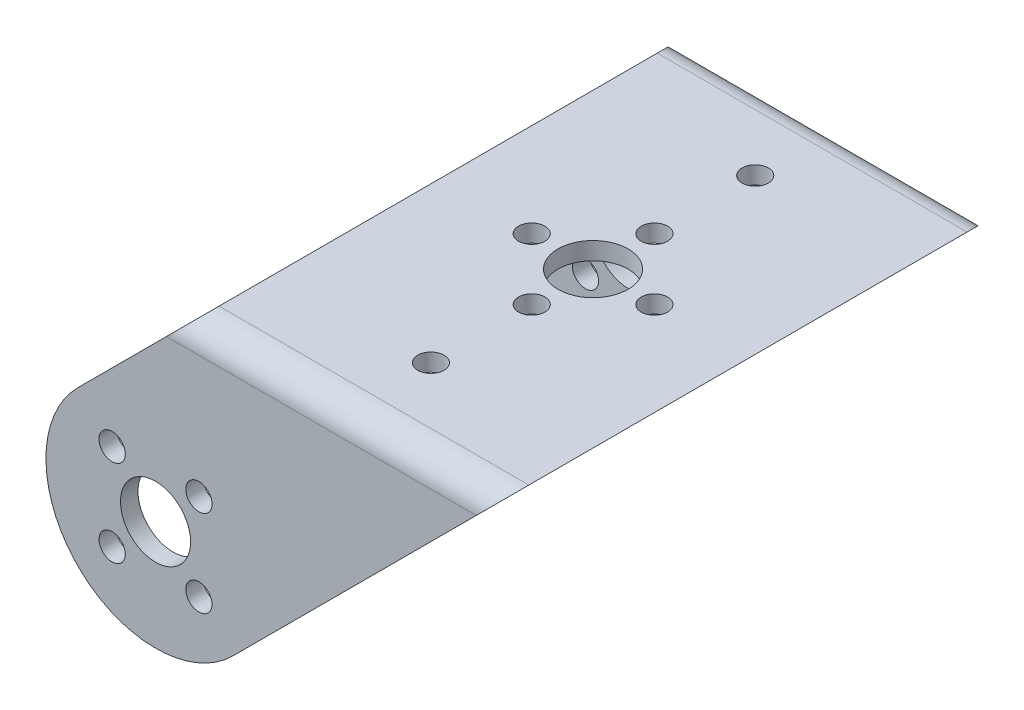
ISO-10303-21;
HEADER;
FILE_DESCRIPTION(('STEP AP214'),'2;1');
FILE_NAME('part.step','',(''),(''),'','','');
FILE_SCHEMA(('AUTOMOTIVE_DESIGN { 1 0 10303 214 1 1 1 1 }'));
ENDSEC;
DATA;
#1=APPLICATION_CONTEXT('core data for automotive mechanical design processes');
#2=APPLICATION_PROTOCOL_DEFINITION('international standard','automotive_design',2000,#1);
#3=PRODUCT_CONTEXT('',#1,'mechanical');
#4=PRODUCT('Part','Part','',(#3));
#5=PRODUCT_RELATED_PRODUCT_CATEGORY('part','',(#4));
#6=PRODUCT_DEFINITION_FORMATION('','',#4);
#7=PRODUCT_DEFINITION_CONTEXT('part definition',#1,'design');
#8=PRODUCT_DEFINITION('design','',#6,#7);
#9=PRODUCT_DEFINITION_SHAPE('','',#8);
#10=(LENGTH_UNIT() NAMED_UNIT(*) SI_UNIT(.MILLI.,.METRE.));
#11=(NAMED_UNIT(*) PLANE_ANGLE_UNIT() SI_UNIT($,.RADIAN.));
#12=(NAMED_UNIT(*) SI_UNIT($,.STERADIAN.) SOLID_ANGLE_UNIT());
#13=UNCERTAINTY_MEASURE_WITH_UNIT(LENGTH_MEASURE(1.E-05),#10,'distance_accuracy_value','');
#14=(GEOMETRIC_REPRESENTATION_CONTEXT(3) GLOBAL_UNCERTAINTY_ASSIGNED_CONTEXT((#13)) GLOBAL_UNIT_ASSIGNED_CONTEXT((#10,
#11,#12)) REPRESENTATION_CONTEXT('',''));
#15=CARTESIAN_POINT('',(0.,0.,0.));
#16=DIRECTION('',(0.,0.,1.));
#17=DIRECTION('',(1.,0.,0.));
#18=AXIS2_PLACEMENT_3D('',#15,#16,#17);
#19=CARTESIAN_POINT('',(0.,0.,0.));
#20=DIRECTION('',(0.,0.,1.));
#21=DIRECTION('',(1.,0.,0.));
#22=AXIS2_PLACEMENT_3D('',#19,#20,#21);
#23=PLANE('',#22);
#24=CARTESIAN_POINT('',(4.94974746830582,4.94974746830584,0.));
#25=DIRECTION('',(0.,0.,1.));
#26=DIRECTION('',(1.,0.,0.));
#27=AXIS2_PLACEMENT_3D('',#24,#25,#26);
#28=CIRCLE('',#27,1.5);
#29=CARTESIAN_POINT('',(6.44974746830583,4.94974746830584,0.));
#30=VERTEX_POINT('',#29);
#31=EDGE_CURVE('E166',#30,#30,#28,.T.);
#32=ORIENTED_EDGE('',*,*,#31,.T.);
#33=EDGE_LOOP('',(#32));
#34=FACE_BOUND('',#33,.T.);
#35=CARTESIAN_POINT('',(-4.94974746830586,4.94974746830581,0.));
#36=DIRECTION('',(0.,0.,1.));
#37=DIRECTION('',(1.,0.,0.));
#38=AXIS2_PLACEMENT_3D('',#35,#36,#37);
#39=CIRCLE('',#38,1.5);
#40=CARTESIAN_POINT('',(-3.44974746830586,4.94974746830581,0.));
#41=VERTEX_POINT('',#40);
#42=EDGE_CURVE('E170',#41,#41,#39,.T.);
#43=ORIENTED_EDGE('',*,*,#42,.T.);
#44=EDGE_LOOP('',(#43));
#45=FACE_BOUND('',#44,.T.);
#46=CARTESIAN_POINT('',(-4.94974746830579,-4.94974746830588,0.));
#47=DIRECTION('',(0.,0.,1.));
#48=DIRECTION('',(1.,0.,0.));
#49=AXIS2_PLACEMENT_3D('',#46,#47,#48);
#50=CIRCLE('',#49,1.5);
#51=CARTESIAN_POINT('',(-3.44974746830579,-4.94974746830588,0.));
#52=VERTEX_POINT('',#51);
#53=EDGE_CURVE('E176',#52,#52,#50,.T.);
#54=ORIENTED_EDGE('',*,*,#53,.T.);
#55=EDGE_LOOP('',(#54));
#56=FACE_BOUND('',#55,.T.);
#57=CARTESIAN_POINT('',(4.94974746830589,-4.94974746830577,0.));
#58=DIRECTION('',(0.,0.,1.));
#59=DIRECTION('',(1.,0.,0.));
#60=AXIS2_PLACEMENT_3D('',#57,#58,#59);
#61=CIRCLE('',#60,1.5);
#62=CARTESIAN_POINT('',(6.44974746830589,-4.94974746830577,0.));
#63=VERTEX_POINT('',#62);
#64=EDGE_CURVE('E182',#63,#63,#61,.T.);
#65=ORIENTED_EDGE('',*,*,#64,.T.);
#66=EDGE_LOOP('',(#65));
#67=FACE_BOUND('',#66,.T.);
#68=CARTESIAN_POINT('',(0.,0.,0.));
#69=DIRECTION('',(0.,0.,1.));
#70=DIRECTION('',(1.,0.,0.));
#71=AXIS2_PLACEMENT_3D('',#68,#69,#70);
#72=CIRCLE('',#71,4.);
#73=CARTESIAN_POINT('',(4.,0.,0.));
#74=VERTEX_POINT('',#73);
#75=EDGE_CURVE('E188',#74,#74,#72,.T.);
#76=ORIENTED_EDGE('',*,*,#75,.T.);
#77=EDGE_LOOP('',(#76));
#78=FACE_BOUND('',#77,.T.);
#79=DIRECTION('',(-0.707106781186544,-0.707106781186551,0.));
#80=VECTOR('',#79,1.);
#81=CARTESIAN_POINT('',(-8.83883476483189,8.83883476483179,0.));
#82=LINE('',#81,#80);
#83=CARTESIAN_POINT('',(1.24264068711919,18.920310216783,0.));
#84=VERTEX_POINT('',#83);
#85=CARTESIAN_POINT('',(-8.83883476483189,8.83883476483179,0.));
#86=VERTEX_POINT('',#85);
#87=EDGE_CURVE('E194',#84,#86,#82,.T.);
#88=ORIENTED_EDGE('',*,*,#87,.F.);
#89=DIRECTION('',(-1.,0.,0.));
#90=VECTOR('',#89,1.);
#91=CARTESIAN_POINT('',(37.5979797464467,18.920310216783,0.));
#92=LINE('',#91,#90);
#93=CARTESIAN_POINT('',(36.5979797464467,18.920310216783,0.));
#94=VERTEX_POINT('',#93);
#95=EDGE_CURVE('E243',#84,#94,#92,.F.);
#96=ORIENTED_EDGE('',*,*,#95,.T.);
#97=DIRECTION('',(0.707106781186548,0.707106781186547,0.));
#98=VECTOR('',#97,1.);
#99=CARTESIAN_POINT('',(8.83883476483195,-8.83883476483173,0.));
#100=LINE('',#99,#98);
#101=CARTESIAN_POINT('',(8.83883476483195,-8.83883476483173,0.));
#102=VERTEX_POINT('',#101);
#103=EDGE_CURVE('E200',#102,#94,#100,.T.);
#104=ORIENTED_EDGE('',*,*,#103,.F.);
#105=CARTESIAN_POINT('',(0.,0.,0.));
#106=DIRECTION('',(0.,0.,1.));
#107=DIRECTION('',(1.,0.,0.));
#108=AXIS2_PLACEMENT_3D('',#105,#106,#107);
#109=CIRCLE('',#108,12.5);
#110=EDGE_CURVE('E207',#86,#102,#109,.T.);
#111=ORIENTED_EDGE('',*,*,#110,.F.);
#112=EDGE_LOOP('',(#88,#96,#104,#111));
#113=FACE_BOUND('',#112,.T.);
#114=ADVANCED_FACE('F36',(#34,#45,#56,#67,#78,#113),#23,.F.);
#115=CARTESIAN_POINT('',(0.,0.,2.));
#116=DIRECTION('',(0.,0.,1.));
#117=DIRECTION('',(1.,0.,0.));
#118=AXIS2_PLACEMENT_3D('',#115,#116,#117);
#119=PLANE('',#118);
#120=CARTESIAN_POINT('',(-4.94974746830586,4.94974746830581,2.));
#121=DIRECTION('',(0.,0.,1.));
#122=DIRECTION('',(1.,0.,0.));
#123=AXIS2_PLACEMENT_3D('',#120,#121,#122);
#124=CIRCLE('',#123,1.5);
#125=CARTESIAN_POINT('',(-3.44974746830586,4.94974746830581,2.));
#126=VERTEX_POINT('',#125);
#127=EDGE_CURVE('E173',#126,#126,#124,.T.);
#128=ORIENTED_EDGE('',*,*,#127,.F.);
#129=EDGE_LOOP('',(#128));
#130=FACE_BOUND('',#129,.T.);
#131=CARTESIAN_POINT('',(4.94974746830589,-4.94974746830577,2.));
#132=DIRECTION('',(0.,0.,1.));
#133=DIRECTION('',(1.,0.,0.));
#134=AXIS2_PLACEMENT_3D('',#131,#132,#133);
#135=CIRCLE('',#134,1.5);
#136=CARTESIAN_POINT('',(6.44974746830589,-4.94974746830577,2.));
#137=VERTEX_POINT('',#136);
#138=EDGE_CURVE('E185',#137,#137,#135,.T.);
#139=ORIENTED_EDGE('',*,*,#138,.F.);
#140=EDGE_LOOP('',(#139));
#141=FACE_BOUND('',#140,.T.);
#142=DIRECTION('',(0.707106781186548,0.707106781186547,0.));
#143=VECTOR('',#142,1.);
#144=CARTESIAN_POINT('',(8.83883476483195,-8.83883476483173,2.));
#145=LINE('',#144,#143);
#146=CARTESIAN_POINT('',(8.83883476483195,-8.83883476483173,2.));
#147=VERTEX_POINT('',#146);
#148=CARTESIAN_POINT('',(36.5979797464467,18.920310216783,2.));
#149=VERTEX_POINT('',#148);
#150=EDGE_CURVE('E202',#147,#149,#145,.T.);
#151=ORIENTED_EDGE('',*,*,#150,.T.);
#152=DIRECTION('',(-1.,0.,0.));
#153=VECTOR('',#152,1.);
#154=CARTESIAN_POINT('',(4.24264068711917,18.920310216783,2.));
#155=LINE('',#154,#153);
#156=CARTESIAN_POINT('',(1.2426406871192,18.920310216783,2.));
#157=VERTEX_POINT('',#156);
#158=EDGE_CURVE('E222',#149,#157,#155,.T.);
#159=ORIENTED_EDGE('',*,*,#158,.T.);
#160=DIRECTION('',(-0.707106781186544,-0.707106781186551,0.));
#161=VECTOR('',#160,1.);
#162=CARTESIAN_POINT('',(-8.83883476483189,8.83883476483179,2.));
#163=LINE('',#162,#161);
#164=CARTESIAN_POINT('',(-8.83883476483189,8.83883476483179,2.));
#165=VERTEX_POINT('',#164);
#166=EDGE_CURVE('E197',#157,#165,#163,.T.);
#167=ORIENTED_EDGE('',*,*,#166,.T.);
#168=CARTESIAN_POINT('',(0.,0.,2.));
#169=DIRECTION('',(0.,0.,1.));
#170=DIRECTION('',(1.,0.,0.));
#171=AXIS2_PLACEMENT_3D('',#168,#169,#170);
#172=CIRCLE('',#171,12.5);
#173=EDGE_CURVE('E199',#165,#147,#172,.T.);
#174=ORIENTED_EDGE('',*,*,#173,.T.);
#175=EDGE_LOOP('',(#151,#159,#167,#174));
#176=FACE_BOUND('',#175,.T.);
#177=CARTESIAN_POINT('',(0.,0.,2.));
#178=DIRECTION('',(0.,0.,1.));
#179=DIRECTION('',(1.,0.,0.));
#180=AXIS2_PLACEMENT_3D('',#177,#178,#179);
#181=CIRCLE('',#180,4.);
#182=CARTESIAN_POINT('',(4.,0.,2.));
#183=VERTEX_POINT('',#182);
#184=EDGE_CURVE('E191',#183,#183,#181,.T.);
#185=ORIENTED_EDGE('',*,*,#184,.F.);
#186=EDGE_LOOP('',(#185));
#187=FACE_BOUND('',#186,.T.);
#188=CARTESIAN_POINT('',(-4.94974746830579,-4.94974746830588,2.));
#189=DIRECTION('',(0.,0.,1.));
#190=DIRECTION('',(1.,0.,0.));
#191=AXIS2_PLACEMENT_3D('',#188,#189,#190);
#192=CIRCLE('',#191,1.5);
#193=CARTESIAN_POINT('',(-3.44974746830579,-4.94974746830588,2.));
#194=VERTEX_POINT('',#193);
#195=EDGE_CURVE('E179',#194,#194,#192,.T.);
#196=ORIENTED_EDGE('',*,*,#195,.F.);
#197=EDGE_LOOP('',(#196));
#198=FACE_BOUND('',#197,.T.);
#199=CARTESIAN_POINT('',(4.94974746830582,4.94974746830584,2.));
#200=DIRECTION('',(0.,0.,1.));
#201=DIRECTION('',(1.,0.,0.));
#202=AXIS2_PLACEMENT_3D('',#199,#200,#201);
#203=CIRCLE('',#202,1.5);
#204=CARTESIAN_POINT('',(6.44974746830583,4.94974746830584,2.));
#205=VERTEX_POINT('',#204);
#206=EDGE_CURVE('E167',#205,#205,#203,.T.);
#207=ORIENTED_EDGE('',*,*,#206,.F.);
#208=EDGE_LOOP('',(#207));
#209=FACE_BOUND('',#208,.T.);
#210=ADVANCED_FACE('F345',(#130,#141,#176,#187,#198,#209),#119,.T.);
#211=CARTESIAN_POINT('',(39.5979797464467,21.920310216783,2.));
#212=DIRECTION('',(0.,-1.,0.));
#213=DIRECTION('',(1.,0.,0.));
#214=AXIS2_PLACEMENT_3D('',#211,#212,#213);
#215=PLANE('',#214);
#216=CARTESIAN_POINT('',(21.9203102167829,21.920310216783,-44.5));
#217=DIRECTION('',(0.,1.,0.));
#218=DIRECTION('',(-1.,0.,0.));
#219=AXIS2_PLACEMENT_3D('',#216,#217,#218);
#220=CIRCLE('',#219,1.5);
#221=CARTESIAN_POINT('',(20.4203102167829,21.920310216783,-44.5));
#222=VERTEX_POINT('',#221);
#223=EDGE_CURVE('E327',#222,#222,#220,.T.);
#224=ORIENTED_EDGE('',*,*,#223,.F.);
#225=EDGE_LOOP('',(#224));
#226=FACE_BOUND('',#225,.T.);
#227=CARTESIAN_POINT('',(21.9203102167829,21.920310216783,-7.5));
#228=DIRECTION('',(0.,1.,0.));
#229=DIRECTION('',(-1.,0.,0.));
#230=AXIS2_PLACEMENT_3D('',#227,#228,#229);
#231=CIRCLE('',#230,1.5);
#232=CARTESIAN_POINT('',(20.4203102167829,21.920310216783,-7.5));
#233=VERTEX_POINT('',#232);
#234=EDGE_CURVE('E321',#233,#233,#231,.T.);
#235=ORIENTED_EDGE('',*,*,#234,.F.);
#236=EDGE_LOOP('',(#235));
#237=FACE_BOUND('',#236,.T.);
#238=CARTESIAN_POINT('',(14.9203102167829,21.920310216783,-26.));
#239=DIRECTION('',(0.,1.,0.));
#240=DIRECTION('',(-1.,0.,0.));
#241=AXIS2_PLACEMENT_3D('',#238,#239,#240);
#242=CIRCLE('',#241,1.5);
#243=CARTESIAN_POINT('',(13.4203102167829,21.920310216783,-26.));
#244=VERTEX_POINT('',#243);
#245=EDGE_CURVE('E304',#244,#244,#242,.T.);
#246=ORIENTED_EDGE('',*,*,#245,.F.);
#247=EDGE_LOOP('',(#246));
#248=FACE_BOUND('',#247,.T.);
#249=CARTESIAN_POINT('',(21.9203102167829,21.920310216783,-33.));
#250=DIRECTION('',(0.,1.,0.));
#251=DIRECTION('',(-1.,0.,0.));
#252=AXIS2_PLACEMENT_3D('',#249,#250,#251);
#253=CIRCLE('',#252,1.5);
#254=CARTESIAN_POINT('',(20.4203102167829,21.920310216783,-33.));
#255=VERTEX_POINT('',#254);
#256=EDGE_CURVE('E297',#255,#255,#253,.T.);
#257=ORIENTED_EDGE('',*,*,#256,.F.);
#258=EDGE_LOOP('',(#257));
#259=FACE_BOUND('',#258,.T.);
#260=CARTESIAN_POINT('',(28.9203102167829,21.920310216783,-26.));
#261=DIRECTION('',(0.,1.,0.));
#262=DIRECTION('',(-1.,0.,0.));
#263=AXIS2_PLACEMENT_3D('',#260,#261,#262);
#264=CIRCLE('',#263,1.5);
#265=CARTESIAN_POINT('',(27.4203102167829,21.920310216783,-26.));
#266=VERTEX_POINT('',#265);
#267=EDGE_CURVE('E316',#266,#266,#264,.T.);
#268=ORIENTED_EDGE('',*,*,#267,.F.);
#269=EDGE_LOOP('',(#268));
#270=FACE_BOUND('',#269,.T.);
#271=CARTESIAN_POINT('',(21.9203102167828,21.920310216783,-19.));
#272=DIRECTION('',(0.,1.,0.));
#273=DIRECTION('',(-1.,0.,0.));
#274=AXIS2_PLACEMENT_3D('',#271,#272,#273);
#275=CIRCLE('',#274,1.5);
#276=CARTESIAN_POINT('',(20.4203102167828,21.920310216783,-19.));
#277=VERTEX_POINT('',#276);
#278=EDGE_CURVE('E309',#277,#277,#275,.T.);
#279=ORIENTED_EDGE('',*,*,#278,.F.);
#280=EDGE_LOOP('',(#279));
#281=FACE_BOUND('',#280,.T.);
#282=CARTESIAN_POINT('',(21.9203102167829,21.920310216783,-26.));
#283=DIRECTION('',(0.,1.,0.));
#284=DIRECTION('',(-1.,0.,0.));
#285=AXIS2_PLACEMENT_3D('',#282,#283,#284);
#286=CIRCLE('',#285,4.);
#287=CARTESIAN_POINT('',(17.9203102167829,21.920310216783,-26.));
#288=VERTEX_POINT('',#287);
#289=EDGE_CURVE('E291',#288,#288,#286,.T.);
#290=ORIENTED_EDGE('',*,*,#289,.F.);
#291=EDGE_LOOP('',(#290));
#292=FACE_BOUND('',#291,.T.);
#293=DIRECTION('',(0.,0.,-1.));
#294=VECTOR('',#293,1.);
#295=CARTESIAN_POINT('',(4.24264068711917,21.920310216783,2.));
#296=LINE('',#295,#294);
#297=CARTESIAN_POINT('',(4.24264068711917,21.920310216783,-1.));
#298=VERTEX_POINT('',#297);
#299=CARTESIAN_POINT('',(4.24264068711917,21.920310216783,-51.));
#300=VERTEX_POINT('',#299);
#301=EDGE_CURVE('E219',#298,#300,#296,.T.);
#302=ORIENTED_EDGE('',*,*,#301,.F.);
#303=DIRECTION('',(-1.,0.,0.));
#304=VECTOR('',#303,1.);
#305=CARTESIAN_POINT('',(39.5979797464467,21.920310216783,-1.));
#306=LINE('',#305,#304);
#307=CARTESIAN_POINT('',(39.5979797464467,21.920310216783,-1.));
#308=VERTEX_POINT('',#307);
#309=EDGE_CURVE('E231',#298,#308,#306,.F.);
#310=ORIENTED_EDGE('',*,*,#309,.T.);
#311=DIRECTION('',(0.,0.,-1.));
#312=VECTOR('',#311,1.);
#313=CARTESIAN_POINT('',(39.5979797464467,21.920310216783,2.));
#314=LINE('',#313,#312);
#315=CARTESIAN_POINT('',(39.5979797464467,21.920310216783,-51.));
#316=VERTEX_POINT('',#315);
#317=EDGE_CURVE('E205',#308,#316,#314,.T.);
#318=ORIENTED_EDGE('',*,*,#317,.T.);
#319=DIRECTION('',(1.,0.,0.));
#320=VECTOR('',#319,1.);
#321=CARTESIAN_POINT('',(4.24264068711917,21.920310216783,-51.));
#322=LINE('',#321,#320);
#323=EDGE_CURVE('E229',#316,#300,#322,.F.);
#324=ORIENTED_EDGE('',*,*,#323,.T.);
#325=EDGE_LOOP('',(#302,#310,#318,#324));
#326=FACE_BOUND('',#325,.T.);
#327=ADVANCED_FACE('F342',(#226,#237,#248,#259,#270,#281,#292,#326),#215,.F.);
#328=CARTESIAN_POINT('',(-8.83883476483189,8.83883476483179,2.));
#329=DIRECTION('',(0.707106781186551,-0.707106781186544,0.));
#330=DIRECTION('',(0.707106781186544,0.707106781186551,0.));
#331=AXIS2_PLACEMENT_3D('',#328,#329,#330);
#332=PLANE('',#331);
#333=ORIENTED_EDGE('',*,*,#166,.F.);
#334=CARTESIAN_POINT('',(1.2426406871192,18.920310216783,-1.));
#335=DIRECTION('',(0.707106781186551,-0.707106781186544,0.));
#336=DIRECTION('',(0.707106781186544,0.707106781186551,0.));
#337=AXIS2_PLACEMENT_3D('',#334,#335,#336);
#338=ELLIPSE('',#337,4.24264068711926,3.);
#339=EDGE_CURVE('E227',#157,#298,#338,.F.);
#340=ORIENTED_EDGE('',*,*,#339,.T.);
#341=ORIENTED_EDGE('',*,*,#301,.T.);
#342=CARTESIAN_POINT('',(1.2426406871192,18.920310216783,-51.));
#343=DIRECTION('',(0.707106781186551,-0.707106781186544,0.));
#344=DIRECTION('',(-0.707106781186544,-0.707106781186551,0.));
#345=AXIS2_PLACEMENT_3D('',#342,#343,#344);
#346=ELLIPSE('',#345,4.24264068711926,3.);
#347=CARTESIAN_POINT('',(1.2426406871192,18.920310216783,-54.));
#348=VERTEX_POINT('',#347);
#349=EDGE_CURVE('E225',#300,#348,#346,.F.);
#350=ORIENTED_EDGE('',*,*,#349,.T.);
#351=DIRECTION('',(0.707106781186544,0.707106781186551,0.));
#352=VECTOR('',#351,1.);
#353=CARTESIAN_POINT('',(2.24264068711918,19.920310216783,-54.));
#354=LINE('',#353,#352);
#355=CARTESIAN_POINT('',(-8.83883476483189,8.83883476483179,-54.));
#356=VERTEX_POINT('',#355);
#357=EDGE_CURVE('E134',#356,#348,#354,.T.);
#358=ORIENTED_EDGE('',*,*,#357,.F.);
#359=DIRECTION('',(0.,0.,1.));
#360=VECTOR('',#359,1.);
#361=CARTESIAN_POINT('',(-8.83883476483189,8.83883476483179,-54.));
#362=LINE('',#361,#360);
#363=CARTESIAN_POINT('',(-8.83883476483189,8.83883476483179,-52.));
#364=VERTEX_POINT('',#363);
#365=EDGE_CURVE('E145',#356,#364,#362,.T.);
#366=ORIENTED_EDGE('',*,*,#365,.T.);
#367=DIRECTION('',(0.707106781186544,0.707106781186551,0.));
#368=VECTOR('',#367,1.);
#369=CARTESIAN_POINT('',(2.24264068711918,19.920310216783,-52.));
#370=LINE('',#369,#368);
#371=CARTESIAN_POINT('',(1.24264068711919,18.920310216783,-52.));
#372=VERTEX_POINT('',#371);
#373=EDGE_CURVE('E154',#364,#372,#370,.T.);
#374=ORIENTED_EDGE('',*,*,#373,.T.);
#375=CARTESIAN_POINT('',(1.24264068711919,18.920310216783,-51.));
#376=DIRECTION('',(0.707106781186551,-0.707106781186544,0.));
#377=DIRECTION('',(0.707106781186544,0.707106781186551,0.));
#378=AXIS2_PLACEMENT_3D('',#375,#376,#377);
#379=ELLIPSE('',#378,1.41421356237309,1.);
#380=CARTESIAN_POINT('',(2.24264068711918,19.920310216783,-51.));
#381=VERTEX_POINT('',#380);
#382=EDGE_CURVE('E44',#372,#381,#379,.T.);
#383=ORIENTED_EDGE('',*,*,#382,.T.);
#384=DIRECTION('',(0.,0.,1.));
#385=VECTOR('',#384,1.);
#386=CARTESIAN_POINT('',(2.24264068711918,19.920310216783,-52.));
#387=LINE('',#386,#385);
#388=CARTESIAN_POINT('',(2.24264068711918,19.920310216783,-1.00000000000001));
#389=VERTEX_POINT('',#388);
#390=EDGE_CURVE('E144',#381,#389,#387,.T.);
#391=ORIENTED_EDGE('',*,*,#390,.T.);
#392=CARTESIAN_POINT('',(1.2426406871192,18.920310216783,-1.));
#393=DIRECTION('',(0.707106781186551,-0.707106781186544,0.));
#394=DIRECTION('',(0.707106781186544,0.707106781186551,0.));
#395=AXIS2_PLACEMENT_3D('',#392,#393,#394);
#396=ELLIPSE('',#395,1.41421356237309,1.);
#397=EDGE_CURVE('E247',#389,#84,#396,.T.);
#398=ORIENTED_EDGE('',*,*,#397,.T.);
#399=ORIENTED_EDGE('',*,*,#87,.T.);
#400=DIRECTION('',(0.,0.,-1.));
#401=VECTOR('',#400,1.);
#402=CARTESIAN_POINT('',(-8.83883476483189,8.83883476483179,2.));
#403=LINE('',#402,#401);
#404=EDGE_CURVE('E216',#165,#86,#403,.T.);
#405=ORIENTED_EDGE('',*,*,#404,.F.);
#406=EDGE_LOOP('',(#333,#340,#341,#350,#358,#366,#374,#383,#391,#398,#399,#405));
#407=FACE_BOUND('',#406,.T.);
#408=ADVANCED_FACE('F253',(#407),#332,.F.);
#409=CARTESIAN_POINT('',(0.,0.,2.));
#410=DIRECTION('',(0.,0.,-1.));
#411=DIRECTION('',(-1.,0.,0.));
#412=AXIS2_PLACEMENT_3D('',#409,#410,#411);
#413=CYLINDRICAL_SURFACE('',#412,12.5);
#414=ORIENTED_EDGE('',*,*,#110,.T.);
#415=DIRECTION('',(0.,0.,-1.));
#416=VECTOR('',#415,1.);
#417=CARTESIAN_POINT('',(8.83883476483195,-8.83883476483173,2.));
#418=LINE('',#417,#416);
#419=EDGE_CURVE('E213',#147,#102,#418,.T.);
#420=ORIENTED_EDGE('',*,*,#419,.F.);
#421=ORIENTED_EDGE('',*,*,#173,.F.);
#422=ORIENTED_EDGE('',*,*,#404,.T.);
#423=EDGE_LOOP('',(#414,#420,#421,#422));
#424=FACE_BOUND('',#423,.T.);
#425=ADVANCED_FACE('F373',(#424),#413,.T.);
#426=CARTESIAN_POINT('',(8.83883476483195,-8.83883476483173,2.));
#427=DIRECTION('',(-0.707106781186547,0.707106781186548,0.));
#428=DIRECTION('',(-0.707106781186548,-0.707106781186547,0.));
#429=AXIS2_PLACEMENT_3D('',#426,#427,#428);
#430=PLANE('',#429);
#431=ORIENTED_EDGE('',*,*,#317,.F.);
#432=CARTESIAN_POINT('',(36.5979797464467,18.920310216783,-1.));
#433=DIRECTION('',(-0.707106781186547,0.707106781186548,0.));
#434=DIRECTION('',(0.707106781186548,0.707106781186547,0.));
#435=AXIS2_PLACEMENT_3D('',#432,#433,#434);
#436=ELLIPSE('',#435,4.24264068711928,3.);
#437=EDGE_CURVE('E235',#308,#149,#436,.F.);
#438=ORIENTED_EDGE('',*,*,#437,.T.);
#439=ORIENTED_EDGE('',*,*,#150,.F.);
#440=ORIENTED_EDGE('',*,*,#419,.T.);
#441=ORIENTED_EDGE('',*,*,#103,.T.);
#442=CARTESIAN_POINT('',(36.5979797464467,18.920310216783,-1.));
#443=DIRECTION('',(-0.707106781186547,0.707106781186548,0.));
#444=DIRECTION('',(0.707106781186548,0.707106781186547,0.));
#445=AXIS2_PLACEMENT_3D('',#442,#443,#444);
#446=ELLIPSE('',#445,1.4142135623731,1.);
#447=CARTESIAN_POINT('',(37.5979797464467,19.920310216783,-1.00000000000001));
#448=VERTEX_POINT('',#447);
#449=EDGE_CURVE('E249',#94,#448,#446,.T.);
#450=ORIENTED_EDGE('',*,*,#449,.T.);
#451=DIRECTION('',(0.,0.,1.));
#452=VECTOR('',#451,1.);
#453=CARTESIAN_POINT('',(37.5979797464467,19.920310216783,-52.));
#454=LINE('',#453,#452);
#455=CARTESIAN_POINT('',(37.5979797464467,19.920310216783,-51.));
#456=VERTEX_POINT('',#455);
#457=EDGE_CURVE('E163',#456,#448,#454,.T.);
#458=ORIENTED_EDGE('',*,*,#457,.F.);
#459=CARTESIAN_POINT('',(36.5979797464467,18.920310216783,-51.));
#460=DIRECTION('',(-0.707106781186547,0.707106781186548,0.));
#461=DIRECTION('',(0.707106781186548,0.707106781186547,0.));
#462=AXIS2_PLACEMENT_3D('',#459,#460,#461);
#463=ELLIPSE('',#462,1.4142135623731,1.);
#464=CARTESIAN_POINT('',(36.5979797464467,18.920310216783,-52.));
#465=VERTEX_POINT('',#464);
#466=EDGE_CURVE('E11',#456,#465,#463,.T.);
#467=ORIENTED_EDGE('',*,*,#466,.T.);
#468=DIRECTION('',(-0.707106781186548,-0.707106781186547,0.));
#469=VECTOR('',#468,1.);
#470=CARTESIAN_POINT('',(8.83883476483195,-8.83883476483173,-52.));
#471=LINE('',#470,#469);
#472=CARTESIAN_POINT('',(8.83883476483195,-8.83883476483173,-52.));
#473=VERTEX_POINT('',#472);
#474=EDGE_CURVE('E140',#465,#473,#471,.T.);
#475=ORIENTED_EDGE('',*,*,#474,.T.);
#476=DIRECTION('',(0.,0.,1.));
#477=VECTOR('',#476,1.);
#478=CARTESIAN_POINT('',(8.83883476483195,-8.83883476483173,-54.));
#479=LINE('',#478,#477);
#480=CARTESIAN_POINT('',(8.83883476483195,-8.83883476483173,-54.));
#481=VERTEX_POINT('',#480);
#482=EDGE_CURVE('E137',#481,#473,#479,.T.);
#483=ORIENTED_EDGE('',*,*,#482,.F.);
#484=DIRECTION('',(-0.707106781186547,-0.707106781186548,0.));
#485=VECTOR('',#484,1.);
#486=CARTESIAN_POINT('',(39.5979797464467,21.920310216783,-54.));
#487=LINE('',#486,#485);
#488=CARTESIAN_POINT('',(36.5979797464467,18.920310216783,-54.));
#489=VERTEX_POINT('',#488);
#490=EDGE_CURVE('E124',#489,#481,#487,.T.);
#491=ORIENTED_EDGE('',*,*,#490,.F.);
#492=CARTESIAN_POINT('',(36.5979797464467,18.920310216783,-51.));
#493=DIRECTION('',(-0.707106781186547,0.707106781186548,0.));
#494=DIRECTION('',(-0.707106781186548,-0.707106781186547,0.));
#495=AXIS2_PLACEMENT_3D('',#492,#493,#494);
#496=ELLIPSE('',#495,4.24264068711928,3.);
#497=EDGE_CURVE('E233',#489,#316,#496,.F.);
#498=ORIENTED_EDGE('',*,*,#497,.T.);
#499=EDGE_LOOP('',(#431,#438,#439,#440,#441,#450,#458,#467,#475,#483,#491,#498));
#500=FACE_BOUND('',#499,.T.);
#501=ADVANCED_FACE('F139',(#500),#430,.F.);
#502=CARTESIAN_POINT('',(0.,0.,2.));
#503=DIRECTION('',(0.,0.,-1.));
#504=DIRECTION('',(-1.,0.,0.));
#505=AXIS2_PLACEMENT_3D('',#502,#503,#504);
#506=CYLINDRICAL_SURFACE('',#505,4.);
#507=ORIENTED_EDGE('',*,*,#184,.T.);
#508=EDGE_LOOP('',(#507));
#509=FACE_BOUND('',#508,.T.);
#510=ORIENTED_EDGE('',*,*,#75,.F.);
#511=EDGE_LOOP('',(#510));
#512=FACE_BOUND('',#511,.T.);
#513=ADVANCED_FACE('F404',(#509,#512),#506,.F.);
#514=CARTESIAN_POINT('',(4.94974746830589,-4.94974746830577,2.));
#515=DIRECTION('',(0.,0.,-1.));
#516=DIRECTION('',(-1.,0.,0.));
#517=AXIS2_PLACEMENT_3D('',#514,#515,#516);
#518=CYLINDRICAL_SURFACE('',#517,1.5);
#519=ORIENTED_EDGE('',*,*,#138,.T.);
#520=EDGE_LOOP('',(#519));
#521=FACE_BOUND('',#520,.T.);
#522=ORIENTED_EDGE('',*,*,#64,.F.);
#523=EDGE_LOOP('',(#522));
#524=FACE_BOUND('',#523,.T.);
#525=ADVANCED_FACE('F459',(#521,#524),#518,.F.);
#526=CARTESIAN_POINT('',(-4.94974746830579,-4.94974746830588,2.));
#527=DIRECTION('',(0.,0.,-1.));
#528=DIRECTION('',(-1.,0.,0.));
#529=AXIS2_PLACEMENT_3D('',#526,#527,#528);
#530=CYLINDRICAL_SURFACE('',#529,1.5);
#531=ORIENTED_EDGE('',*,*,#195,.T.);
#532=EDGE_LOOP('',(#531));
#533=FACE_BOUND('',#532,.T.);
#534=ORIENTED_EDGE('',*,*,#53,.F.);
#535=EDGE_LOOP('',(#534));
#536=FACE_BOUND('',#535,.T.);
#537=ADVANCED_FACE('F455',(#533,#536),#530,.F.);
#538=CARTESIAN_POINT('',(-4.94974746830586,4.94974746830581,2.));
#539=DIRECTION('',(0.,0.,-1.));
#540=DIRECTION('',(-1.,0.,0.));
#541=AXIS2_PLACEMENT_3D('',#538,#539,#540);
#542=CYLINDRICAL_SURFACE('',#541,1.5);
#543=ORIENTED_EDGE('',*,*,#127,.T.);
#544=EDGE_LOOP('',(#543));
#545=FACE_BOUND('',#544,.T.);
#546=ORIENTED_EDGE('',*,*,#42,.F.);
#547=EDGE_LOOP('',(#546));
#548=FACE_BOUND('',#547,.T.);
#549=ADVANCED_FACE('F451',(#545,#548),#542,.F.);
#550=CARTESIAN_POINT('',(4.94974746830582,4.94974746830584,2.));
#551=DIRECTION('',(0.,0.,-1.));
#552=DIRECTION('',(-1.,0.,0.));
#553=AXIS2_PLACEMENT_3D('',#550,#551,#552);
#554=CYLINDRICAL_SURFACE('',#553,1.5);
#555=ORIENTED_EDGE('',*,*,#206,.T.);
#556=EDGE_LOOP('',(#555));
#557=FACE_BOUND('',#556,.T.);
#558=ORIENTED_EDGE('',*,*,#31,.F.);
#559=EDGE_LOOP('',(#558));
#560=FACE_BOUND('',#559,.T.);
#561=ADVANCED_FACE('F448',(#557,#560),#554,.F.);
#562=CARTESIAN_POINT('',(37.5979797464467,19.920310216783,-52.));
#563=DIRECTION('',(0.,1.,0.));
#564=DIRECTION('',(-1.,0.,0.));
#565=AXIS2_PLACEMENT_3D('',#562,#563,#564);
#566=PLANE('',#565);
#567=CARTESIAN_POINT('',(21.9203102167829,19.920310216783,-44.5));
#568=DIRECTION('',(0.,1.,0.));
#569=DIRECTION('',(-1.,0.,0.));
#570=AXIS2_PLACEMENT_3D('',#567,#568,#569);
#571=CIRCLE('',#570,1.5);
#572=CARTESIAN_POINT('',(20.4203102167829,19.920310216783,-44.5));
#573=VERTEX_POINT('',#572);
#574=EDGE_CURVE('E313',#573,#573,#571,.T.);
#575=ORIENTED_EDGE('',*,*,#574,.T.);
#576=EDGE_LOOP('',(#575));
#577=FACE_BOUND('',#576,.T.);
#578=CARTESIAN_POINT('',(21.9203102167829,19.920310216783,-7.5));
#579=DIRECTION('',(0.,1.,0.));
#580=DIRECTION('',(-1.,0.,0.));
#581=AXIS2_PLACEMENT_3D('',#578,#579,#580);
#582=CIRCLE('',#581,1.5);
#583=CARTESIAN_POINT('',(20.4203102167829,19.920310216783,-7.5));
#584=VERTEX_POINT('',#583);
#585=EDGE_CURVE('E324',#584,#584,#582,.T.);
#586=ORIENTED_EDGE('',*,*,#585,.T.);
#587=EDGE_LOOP('',(#586));
#588=FACE_BOUND('',#587,.T.);
#589=CARTESIAN_POINT('',(14.9203102167829,19.920310216783,-26.));
#590=DIRECTION('',(0.,1.,0.));
#591=DIRECTION('',(-1.,0.,0.));
#592=AXIS2_PLACEMENT_3D('',#589,#590,#591);
#593=CIRCLE('',#592,1.5);
#594=CARTESIAN_POINT('',(13.4203102167829,19.920310216783,-26.));
#595=VERTEX_POINT('',#594);
#596=EDGE_CURVE('E294',#595,#595,#593,.T.);
#597=ORIENTED_EDGE('',*,*,#596,.T.);
#598=EDGE_LOOP('',(#597));
#599=FACE_BOUND('',#598,.T.);
#600=CARTESIAN_POINT('',(21.9203102167829,19.920310216783,-33.));
#601=DIRECTION('',(0.,1.,0.));
#602=DIRECTION('',(-1.,0.,0.));
#603=AXIS2_PLACEMENT_3D('',#600,#601,#602);
#604=CIRCLE('',#603,1.5);
#605=CARTESIAN_POINT('',(20.4203102167829,19.920310216783,-33.));
#606=VERTEX_POINT('',#605);
#607=EDGE_CURVE('E300',#606,#606,#604,.T.);
#608=ORIENTED_EDGE('',*,*,#607,.T.);
#609=EDGE_LOOP('',(#608));
#610=FACE_BOUND('',#609,.T.);
#611=CARTESIAN_POINT('',(28.9203102167829,19.920310216783,-26.));
#612=DIRECTION('',(0.,1.,0.));
#613=DIRECTION('',(-1.,0.,0.));
#614=AXIS2_PLACEMENT_3D('',#611,#612,#613);
#615=CIRCLE('',#614,1.5);
#616=CARTESIAN_POINT('',(27.4203102167829,19.920310216783,-26.));
#617=VERTEX_POINT('',#616);
#618=EDGE_CURVE('E301',#617,#617,#615,.T.);
#619=ORIENTED_EDGE('',*,*,#618,.T.);
#620=EDGE_LOOP('',(#619));
#621=FACE_BOUND('',#620,.T.);
#622=CARTESIAN_POINT('',(21.9203102167828,19.920310216783,-19.));
#623=DIRECTION('',(0.,1.,0.));
#624=DIRECTION('',(-1.,0.,0.));
#625=AXIS2_PLACEMENT_3D('',#622,#623,#624);
#626=CIRCLE('',#625,1.5);
#627=CARTESIAN_POINT('',(20.4203102167828,19.920310216783,-19.));
#628=VERTEX_POINT('',#627);
#629=EDGE_CURVE('E312',#628,#628,#626,.T.);
#630=ORIENTED_EDGE('',*,*,#629,.T.);
#631=EDGE_LOOP('',(#630));
#632=FACE_BOUND('',#631,.T.);
#633=CARTESIAN_POINT('',(21.9203102167829,19.920310216783,-26.));
#634=DIRECTION('',(0.,1.,0.));
#635=DIRECTION('',(-1.,0.,0.));
#636=AXIS2_PLACEMENT_3D('',#633,#634,#635);
#637=CIRCLE('',#636,4.);
#638=CARTESIAN_POINT('',(17.9203102167829,19.920310216783,-26.));
#639=VERTEX_POINT('',#638);
#640=EDGE_CURVE('E288',#639,#639,#637,.T.);
#641=ORIENTED_EDGE('',*,*,#640,.T.);
#642=EDGE_LOOP('',(#641));
#643=FACE_BOUND('',#642,.T.);
#644=ORIENTED_EDGE('',*,*,#457,.T.);
#645=DIRECTION('',(-1.,0.,0.));
#646=VECTOR('',#645,1.);
#647=CARTESIAN_POINT('',(2.24264068711919,19.920310216783,-1.));
#648=LINE('',#647,#646);
#649=EDGE_CURVE('E240',#448,#389,#648,.T.);
#650=ORIENTED_EDGE('',*,*,#649,.T.);
#651=ORIENTED_EDGE('',*,*,#390,.F.);
#652=DIRECTION('',(-1.,0.,0.));
#653=VECTOR('',#652,1.);
#654=CARTESIAN_POINT('',(37.5979797464467,19.920310216783,-51.));
#655=LINE('',#654,#653);
#656=EDGE_CURVE('E238',#381,#456,#655,.F.);
#657=ORIENTED_EDGE('',*,*,#656,.T.);
#658=EDGE_LOOP('',(#644,#650,#651,#657));
#659=FACE_BOUND('',#658,.T.);
#660=ADVANCED_FACE('F255',(#577,#588,#599,#610,#621,#632,#643,#659),#566,.F.);
#661=CARTESIAN_POINT('',(0.,0.,-52.));
#662=DIRECTION('',(0.,0.,-1.));
#663=DIRECTION('',(-1.,0.,0.));
#664=AXIS2_PLACEMENT_3D('',#661,#662,#663);
#665=PLANE('',#664);
#666=CARTESIAN_POINT('',(4.94974746830589,-4.94974746830577,-52.));
#667=DIRECTION('',(0.,0.,-1.));
#668=DIRECTION('',(-1.,0.,0.));
#669=AXIS2_PLACEMENT_3D('',#666,#667,#668);
#670=CIRCLE('',#669,1.5);
#671=CARTESIAN_POINT('',(3.44974746830589,-4.94974746830577,-52.));
#672=VERTEX_POINT('',#671);
#673=EDGE_CURVE('E261',#672,#672,#670,.T.);
#674=ORIENTED_EDGE('',*,*,#673,.T.);
#675=EDGE_LOOP('',(#674));
#676=FACE_BOUND('',#675,.T.);
#677=CARTESIAN_POINT('',(4.94974746830582,4.94974746830584,-52.));
#678=DIRECTION('',(0.,0.,-1.));
#679=DIRECTION('',(-1.,0.,0.));
#680=AXIS2_PLACEMENT_3D('',#677,#678,#679);
#681=CIRCLE('',#680,1.5);
#682=CARTESIAN_POINT('',(3.44974746830582,4.94974746830584,-52.));
#683=VERTEX_POINT('',#682);
#684=EDGE_CURVE('E267',#683,#683,#681,.T.);
#685=ORIENTED_EDGE('',*,*,#684,.T.);
#686=EDGE_LOOP('',(#685));
#687=FACE_BOUND('',#686,.T.);
#688=CARTESIAN_POINT('',(0.,0.,-52.));
#689=DIRECTION('',(0.,0.,-1.));
#690=DIRECTION('',(-1.,0.,0.));
#691=AXIS2_PLACEMENT_3D('',#688,#689,#690);
#692=CIRCLE('',#691,4.);
#693=CARTESIAN_POINT('',(-4.,0.,-52.));
#694=VERTEX_POINT('',#693);
#695=EDGE_CURVE('E273',#694,#694,#692,.T.);
#696=ORIENTED_EDGE('',*,*,#695,.T.);
#697=EDGE_LOOP('',(#696));
#698=FACE_BOUND('',#697,.T.);
#699=CARTESIAN_POINT('',(-4.94974746830586,4.94974746830581,-52.));
#700=DIRECTION('',(0.,0.,-1.));
#701=DIRECTION('',(-1.,0.,0.));
#702=AXIS2_PLACEMENT_3D('',#699,#700,#701);
#703=CIRCLE('',#702,1.5);
#704=CARTESIAN_POINT('',(-6.44974746830586,4.94974746830581,-52.));
#705=VERTEX_POINT('',#704);
#706=EDGE_CURVE('E279',#705,#705,#703,.T.);
#707=ORIENTED_EDGE('',*,*,#706,.T.);
#708=EDGE_LOOP('',(#707));
#709=FACE_BOUND('',#708,.T.);
#710=CARTESIAN_POINT('',(-4.94974746830579,-4.94974746830588,-52.));
#711=DIRECTION('',(0.,0.,-1.));
#712=DIRECTION('',(-1.,0.,0.));
#713=AXIS2_PLACEMENT_3D('',#710,#711,#712);
#714=CIRCLE('',#713,1.5);
#715=CARTESIAN_POINT('',(-6.44974746830579,-4.94974746830588,-52.));
#716=VERTEX_POINT('',#715);
#717=EDGE_CURVE('E285',#716,#716,#714,.T.);
#718=ORIENTED_EDGE('',*,*,#717,.T.);
#719=EDGE_LOOP('',(#718));
#720=FACE_BOUND('',#719,.T.);
#721=ORIENTED_EDGE('',*,*,#474,.F.);
#722=DIRECTION('',(-1.,0.,0.));
#723=VECTOR('',#722,1.);
#724=CARTESIAN_POINT('',(2.24264068711918,18.920310216783,-52.));
#725=LINE('',#724,#723);
#726=EDGE_CURVE('E245',#465,#372,#725,.T.);
#727=ORIENTED_EDGE('',*,*,#726,.T.);
#728=ORIENTED_EDGE('',*,*,#373,.F.);
#729=CARTESIAN_POINT('',(0.,0.,-52.));
#730=DIRECTION('',(0.,0.,-1.));
#731=DIRECTION('',(-1.,0.,0.));
#732=AXIS2_PLACEMENT_3D('',#729,#730,#731);
#733=CIRCLE('',#732,12.5);
#734=EDGE_CURVE('E159',#473,#364,#733,.T.);
#735=ORIENTED_EDGE('',*,*,#734,.F.);
#736=EDGE_LOOP('',(#721,#727,#728,#735));
#737=FACE_BOUND('',#736,.T.);
#738=ADVANCED_FACE('F258',(#676,#687,#698,#709,#720,#737),#665,.F.);
#739=CARTESIAN_POINT('',(0.,0.,-54.));
#740=DIRECTION('',(0.,0.,-1.));
#741=DIRECTION('',(-1.,0.,0.));
#742=AXIS2_PLACEMENT_3D('',#739,#740,#741);
#743=PLANE('',#742);
#744=CARTESIAN_POINT('',(-4.94974746830586,4.94974746830581,-54.));
#745=DIRECTION('',(0.,0.,-1.));
#746=DIRECTION('',(-1.,0.,0.));
#747=AXIS2_PLACEMENT_3D('',#744,#745,#746);
#748=CIRCLE('',#747,1.5);
#749=CARTESIAN_POINT('',(-6.44974746830586,4.94974746830581,-54.));
#750=VERTEX_POINT('',#749);
#751=EDGE_CURVE('E276',#750,#750,#748,.T.);
#752=ORIENTED_EDGE('',*,*,#751,.F.);
#753=EDGE_LOOP('',(#752));
#754=FACE_BOUND('',#753,.T.);
#755=CARTESIAN_POINT('',(4.94974746830582,4.94974746830584,-54.));
#756=DIRECTION('',(0.,0.,-1.));
#757=DIRECTION('',(-1.,0.,0.));
#758=AXIS2_PLACEMENT_3D('',#755,#756,#757);
#759=CIRCLE('',#758,1.5);
#760=CARTESIAN_POINT('',(3.44974746830582,4.94974746830584,-54.));
#761=VERTEX_POINT('',#760);
#762=EDGE_CURVE('E264',#761,#761,#759,.T.);
#763=ORIENTED_EDGE('',*,*,#762,.F.);
#764=EDGE_LOOP('',(#763));
#765=FACE_BOUND('',#764,.T.);
#766=ORIENTED_EDGE('',*,*,#357,.T.);
#767=DIRECTION('',(1.,0.,0.));
#768=VECTOR('',#767,1.);
#769=CARTESIAN_POINT('',(39.5979797464467,18.920310216783,-54.));
#770=LINE('',#769,#768);
#771=EDGE_CURVE('E133',#348,#489,#770,.T.);
#772=ORIENTED_EDGE('',*,*,#771,.T.);
#773=ORIENTED_EDGE('',*,*,#490,.T.);
#774=CARTESIAN_POINT('',(0.,0.,-54.));
#775=DIRECTION('',(0.,0.,-1.));
#776=DIRECTION('',(-1.,0.,0.));
#777=AXIS2_PLACEMENT_3D('',#774,#775,#776);
#778=CIRCLE('',#777,12.5);
#779=EDGE_CURVE('E130',#481,#356,#778,.T.);
#780=ORIENTED_EDGE('',*,*,#779,.T.);
#781=EDGE_LOOP('',(#766,#772,#773,#780));
#782=FACE_BOUND('',#781,.T.);
#783=CARTESIAN_POINT('',(4.94974746830589,-4.94974746830577,-54.));
#784=DIRECTION('',(0.,0.,-1.));
#785=DIRECTION('',(-1.,0.,0.));
#786=AXIS2_PLACEMENT_3D('',#783,#784,#785);
#787=CIRCLE('',#786,1.5);
#788=CARTESIAN_POINT('',(3.44974746830589,-4.94974746830577,-54.));
#789=VERTEX_POINT('',#788);
#790=EDGE_CURVE('E157',#789,#789,#787,.T.);
#791=ORIENTED_EDGE('',*,*,#790,.F.);
#792=EDGE_LOOP('',(#791));
#793=FACE_BOUND('',#792,.T.);
#794=CARTESIAN_POINT('',(0.,0.,-54.));
#795=DIRECTION('',(0.,0.,-1.));
#796=DIRECTION('',(-1.,0.,0.));
#797=AXIS2_PLACEMENT_3D('',#794,#795,#796);
#798=CIRCLE('',#797,4.);
#799=CARTESIAN_POINT('',(-4.,0.,-54.));
#800=VERTEX_POINT('',#799);
#801=EDGE_CURVE('E270',#800,#800,#798,.T.);
#802=ORIENTED_EDGE('',*,*,#801,.F.);
#803=EDGE_LOOP('',(#802));
#804=FACE_BOUND('',#803,.T.);
#805=CARTESIAN_POINT('',(-4.94974746830579,-4.94974746830588,-54.));
#806=DIRECTION('',(0.,0.,-1.));
#807=DIRECTION('',(-1.,0.,0.));
#808=AXIS2_PLACEMENT_3D('',#805,#806,#807);
#809=CIRCLE('',#808,1.5);
#810=CARTESIAN_POINT('',(-6.44974746830579,-4.94974746830588,-54.));
#811=VERTEX_POINT('',#810);
#812=EDGE_CURVE('E282',#811,#811,#809,.T.);
#813=ORIENTED_EDGE('',*,*,#812,.F.);
#814=EDGE_LOOP('',(#813));
#815=FACE_BOUND('',#814,.T.);
#816=ADVANCED_FACE('F127',(#754,#765,#782,#793,#804,#815),#743,.T.);
#817=CARTESIAN_POINT('',(0.,0.,-54.));
#818=DIRECTION('',(0.,0.,1.));
#819=DIRECTION('',(1.,0.,0.));
#820=AXIS2_PLACEMENT_3D('',#817,#818,#819);
#821=CYLINDRICAL_SURFACE('',#820,12.5);
#822=ORIENTED_EDGE('',*,*,#734,.T.);
#823=ORIENTED_EDGE('',*,*,#365,.F.);
#824=ORIENTED_EDGE('',*,*,#779,.F.);
#825=ORIENTED_EDGE('',*,*,#482,.T.);
#826=EDGE_LOOP('',(#822,#823,#824,#825));
#827=FACE_BOUND('',#826,.T.);
#828=ADVANCED_FACE('F147',(#827),#821,.T.);
#829=CARTESIAN_POINT('',(4.94974746830589,-4.94974746830577,-54.));
#830=DIRECTION('',(0.,0.,1.));
#831=DIRECTION('',(1.,0.,0.));
#832=AXIS2_PLACEMENT_3D('',#829,#830,#831);
#833=CYLINDRICAL_SURFACE('',#832,1.5);
#834=ORIENTED_EDGE('',*,*,#790,.T.);
#835=EDGE_LOOP('',(#834));
#836=FACE_BOUND('',#835,.T.);
#837=ORIENTED_EDGE('',*,*,#673,.F.);
#838=EDGE_LOOP('',(#837));
#839=FACE_BOUND('',#838,.T.);
#840=ADVANCED_FACE('F433',(#836,#839),#833,.F.);
#841=CARTESIAN_POINT('',(4.94974746830582,4.94974746830584,-54.));
#842=DIRECTION('',(0.,0.,1.));
#843=DIRECTION('',(1.,0.,0.));
#844=AXIS2_PLACEMENT_3D('',#841,#842,#843);
#845=CYLINDRICAL_SURFACE('',#844,1.5);
#846=ORIENTED_EDGE('',*,*,#762,.T.);
#847=EDGE_LOOP('',(#846));
#848=FACE_BOUND('',#847,.T.);
#849=ORIENTED_EDGE('',*,*,#684,.F.);
#850=EDGE_LOOP('',(#849));
#851=FACE_BOUND('',#850,.T.);
#852=ADVANCED_FACE('F429',(#848,#851),#845,.F.);
#853=CARTESIAN_POINT('',(0.,0.,-54.));
#854=DIRECTION('',(0.,0.,1.));
#855=DIRECTION('',(1.,0.,0.));
#856=AXIS2_PLACEMENT_3D('',#853,#854,#855);
#857=CYLINDRICAL_SURFACE('',#856,4.);
#858=ORIENTED_EDGE('',*,*,#801,.T.);
#859=EDGE_LOOP('',(#858));
#860=FACE_BOUND('',#859,.T.);
#861=ORIENTED_EDGE('',*,*,#695,.F.);
#862=EDGE_LOOP('',(#861));
#863=FACE_BOUND('',#862,.T.);
#864=ADVANCED_FACE('F420',(#860,#863),#857,.F.);
#865=CARTESIAN_POINT('',(-4.94974746830586,4.94974746830581,-54.));
#866=DIRECTION('',(0.,0.,1.));
#867=DIRECTION('',(1.,0.,0.));
#868=AXIS2_PLACEMENT_3D('',#865,#866,#867);
#869=CYLINDRICAL_SURFACE('',#868,1.5);
#870=ORIENTED_EDGE('',*,*,#751,.T.);
#871=EDGE_LOOP('',(#870));
#872=FACE_BOUND('',#871,.T.);
#873=ORIENTED_EDGE('',*,*,#706,.F.);
#874=EDGE_LOOP('',(#873));
#875=FACE_BOUND('',#874,.T.);
#876=ADVANCED_FACE('F414',(#872,#875),#869,.F.);
#877=CARTESIAN_POINT('',(-4.94974746830579,-4.94974746830588,-54.));
#878=DIRECTION('',(0.,0.,1.));
#879=DIRECTION('',(1.,0.,0.));
#880=AXIS2_PLACEMENT_3D('',#877,#878,#879);
#881=CYLINDRICAL_SURFACE('',#880,1.5);
#882=ORIENTED_EDGE('',*,*,#812,.T.);
#883=EDGE_LOOP('',(#882));
#884=FACE_BOUND('',#883,.T.);
#885=ORIENTED_EDGE('',*,*,#717,.F.);
#886=EDGE_LOOP('',(#885));
#887=FACE_BOUND('',#886,.T.);
#888=ADVANCED_FACE('F410',(#884,#887),#881,.F.);
#889=CARTESIAN_POINT('',(0.,18.920310216783,-1.));
#890=DIRECTION('',(1.,0.,0.));
#891=DIRECTION('',(0.,1.,0.));
#892=AXIS2_PLACEMENT_3D('',#889,#890,#891);
#893=CYLINDRICAL_SURFACE('',#892,3.);
#894=ORIENTED_EDGE('',*,*,#437,.F.);
#895=ORIENTED_EDGE('',*,*,#309,.F.);
#896=ORIENTED_EDGE('',*,*,#339,.F.);
#897=ORIENTED_EDGE('',*,*,#158,.F.);
#898=EDGE_LOOP('',(#894,#895,#896,#897));
#899=FACE_BOUND('',#898,.T.);
#900=ADVANCED_FACE('F364',(#899),#893,.T.);
#901=CARTESIAN_POINT('',(0.,18.920310216783,-51.));
#902=DIRECTION('',(-1.,0.,0.));
#903=DIRECTION('',(0.,-1.,0.));
#904=AXIS2_PLACEMENT_3D('',#901,#902,#903);
#905=CYLINDRICAL_SURFACE('',#904,3.);
#906=ORIENTED_EDGE('',*,*,#349,.F.);
#907=ORIENTED_EDGE('',*,*,#323,.F.);
#908=ORIENTED_EDGE('',*,*,#497,.F.);
#909=ORIENTED_EDGE('',*,*,#771,.F.);
#910=EDGE_LOOP('',(#906,#907,#908,#909));
#911=FACE_BOUND('',#910,.T.);
#912=ADVANCED_FACE('F383',(#911),#905,.T.);
#913=CARTESIAN_POINT('',(37.5979797464467,18.920310216783,-1.));
#914=DIRECTION('',(1.,0.,0.));
#915=DIRECTION('',(0.,1.,0.));
#916=AXIS2_PLACEMENT_3D('',#913,#914,#915);
#917=CYLINDRICAL_SURFACE('',#916,1.);
#918=ORIENTED_EDGE('',*,*,#449,.F.);
#919=ORIENTED_EDGE('',*,*,#95,.F.);
#920=ORIENTED_EDGE('',*,*,#397,.F.);
#921=ORIENTED_EDGE('',*,*,#649,.F.);
#922=EDGE_LOOP('',(#918,#919,#920,#921));
#923=FACE_BOUND('',#922,.T.);
#924=ADVANCED_FACE('F381',(#923),#917,.F.);
#925=CARTESIAN_POINT('',(0.,18.920310216783,-51.));
#926=DIRECTION('',(1.,0.,0.));
#927=DIRECTION('',(0.,1.,0.));
#928=AXIS2_PLACEMENT_3D('',#925,#926,#927);
#929=CYLINDRICAL_SURFACE('',#928,1.);
#930=ORIENTED_EDGE('',*,*,#466,.F.);
#931=ORIENTED_EDGE('',*,*,#656,.F.);
#932=ORIENTED_EDGE('',*,*,#382,.F.);
#933=ORIENTED_EDGE('',*,*,#726,.F.);
#934=EDGE_LOOP('',(#930,#931,#932,#933));
#935=FACE_BOUND('',#934,.T.);
#936=ADVANCED_FACE('F38',(#935),#929,.F.);
#937=CARTESIAN_POINT('',(21.9203102167829,19.920310216783,-26.));
#938=DIRECTION('',(0.,1.,0.));
#939=DIRECTION('',(-1.,0.,0.));
#940=AXIS2_PLACEMENT_3D('',#937,#938,#939);
#941=CYLINDRICAL_SURFACE('',#940,4.);
#942=ORIENTED_EDGE('',*,*,#640,.F.);
#943=EDGE_LOOP('',(#942));
#944=FACE_BOUND('',#943,.T.);
#945=ORIENTED_EDGE('',*,*,#289,.T.);
#946=EDGE_LOOP('',(#945));
#947=FACE_BOUND('',#946,.T.);
#948=ADVANCED_FACE('F388',(#944,#947),#941,.F.);
#949=CARTESIAN_POINT('',(21.9203102167828,19.920310216783,-19.));
#950=DIRECTION('',(0.,1.,0.));
#951=DIRECTION('',(-1.,0.,0.));
#952=AXIS2_PLACEMENT_3D('',#949,#950,#951);
#953=CYLINDRICAL_SURFACE('',#952,1.5);
#954=ORIENTED_EDGE('',*,*,#629,.F.);
#955=EDGE_LOOP('',(#954));
#956=FACE_BOUND('',#955,.T.);
#957=ORIENTED_EDGE('',*,*,#278,.T.);
#958=EDGE_LOOP('',(#957));
#959=FACE_BOUND('',#958,.T.);
#960=ADVANCED_FACE('F648',(#956,#959),#953,.F.);
#961=CARTESIAN_POINT('',(28.9203102167829,19.920310216783,-26.));
#962=DIRECTION('',(0.,1.,0.));
#963=DIRECTION('',(-1.,0.,0.));
#964=AXIS2_PLACEMENT_3D('',#961,#962,#963);
#965=CYLINDRICAL_SURFACE('',#964,1.5);
#966=ORIENTED_EDGE('',*,*,#618,.F.);
#967=EDGE_LOOP('',(#966));
#968=FACE_BOUND('',#967,.T.);
#969=ORIENTED_EDGE('',*,*,#267,.T.);
#970=EDGE_LOOP('',(#969));
#971=FACE_BOUND('',#970,.T.);
#972=ADVANCED_FACE('F656',(#968,#971),#965,.F.);
#973=CARTESIAN_POINT('',(21.9203102167829,19.920310216783,-33.));
#974=DIRECTION('',(0.,1.,0.));
#975=DIRECTION('',(-1.,0.,0.));
#976=AXIS2_PLACEMENT_3D('',#973,#974,#975);
#977=CYLINDRICAL_SURFACE('',#976,1.5);
#978=ORIENTED_EDGE('',*,*,#607,.F.);
#979=EDGE_LOOP('',(#978));
#980=FACE_BOUND('',#979,.T.);
#981=ORIENTED_EDGE('',*,*,#256,.T.);
#982=EDGE_LOOP('',(#981));
#983=FACE_BOUND('',#982,.T.);
#984=ADVANCED_FACE('F665',(#980,#983),#977,.F.);
#985=CARTESIAN_POINT('',(14.9203102167829,19.920310216783,-26.));
#986=DIRECTION('',(0.,1.,0.));
#987=DIRECTION('',(-1.,0.,0.));
#988=AXIS2_PLACEMENT_3D('',#985,#986,#987);
#989=CYLINDRICAL_SURFACE('',#988,1.5);
#990=ORIENTED_EDGE('',*,*,#596,.F.);
#991=EDGE_LOOP('',(#990));
#992=FACE_BOUND('',#991,.T.);
#993=ORIENTED_EDGE('',*,*,#245,.T.);
#994=EDGE_LOOP('',(#993));
#995=FACE_BOUND('',#994,.T.);
#996=ADVANCED_FACE('F674',(#992,#995),#989,.F.);
#997=CARTESIAN_POINT('',(21.9203102167829,19.920310216783,-7.5));
#998=DIRECTION('',(0.,1.,0.));
#999=DIRECTION('',(-1.,0.,0.));
#1000=AXIS2_PLACEMENT_3D('',#997,#998,#999);
#1001=CYLINDRICAL_SURFACE('',#1000,1.5);
#1002=ORIENTED_EDGE('',*,*,#585,.F.);
#1003=EDGE_LOOP('',(#1002));
#1004=FACE_BOUND('',#1003,.T.);
#1005=ORIENTED_EDGE('',*,*,#234,.T.);
#1006=EDGE_LOOP('',(#1005));
#1007=FACE_BOUND('',#1006,.T.);
#1008=ADVANCED_FACE('F338',(#1004,#1007),#1001,.F.);
#1009=CARTESIAN_POINT('',(21.9203102167829,19.920310216783,-44.5));
#1010=DIRECTION('',(0.,1.,0.));
#1011=DIRECTION('',(-1.,0.,0.));
#1012=AXIS2_PLACEMENT_3D('',#1009,#1010,#1011);
#1013=CYLINDRICAL_SURFACE('',#1012,1.5);
#1014=ORIENTED_EDGE('',*,*,#574,.F.);
#1015=EDGE_LOOP('',(#1014));
#1016=FACE_BOUND('',#1015,.T.);
#1017=ORIENTED_EDGE('',*,*,#223,.T.);
#1018=EDGE_LOOP('',(#1017));
#1019=FACE_BOUND('',#1018,.T.);
#1020=ADVANCED_FACE('F335',(#1016,#1019),#1013,.F.);
#1021=CLOSED_SHELL('',(#114,#210,#327,#408,#425,#501,#513,#525,#537,#549,#561,#660,#738,#816,
#828,#840,#852,#864,#876,#888,#900,#912,#924,#936,#948,#960,#972,#984,#996,#1008,#1020));
#1022=MANIFOLD_SOLID_BREP('B2',#1021);
#1023=ADVANCED_BREP_SHAPE_REPRESENTATION('',(#18,#1022),#14);
#1024=SHAPE_DEFINITION_REPRESENTATION(#9,#1023);
ENDSEC;
END-ISO-10303-21;
